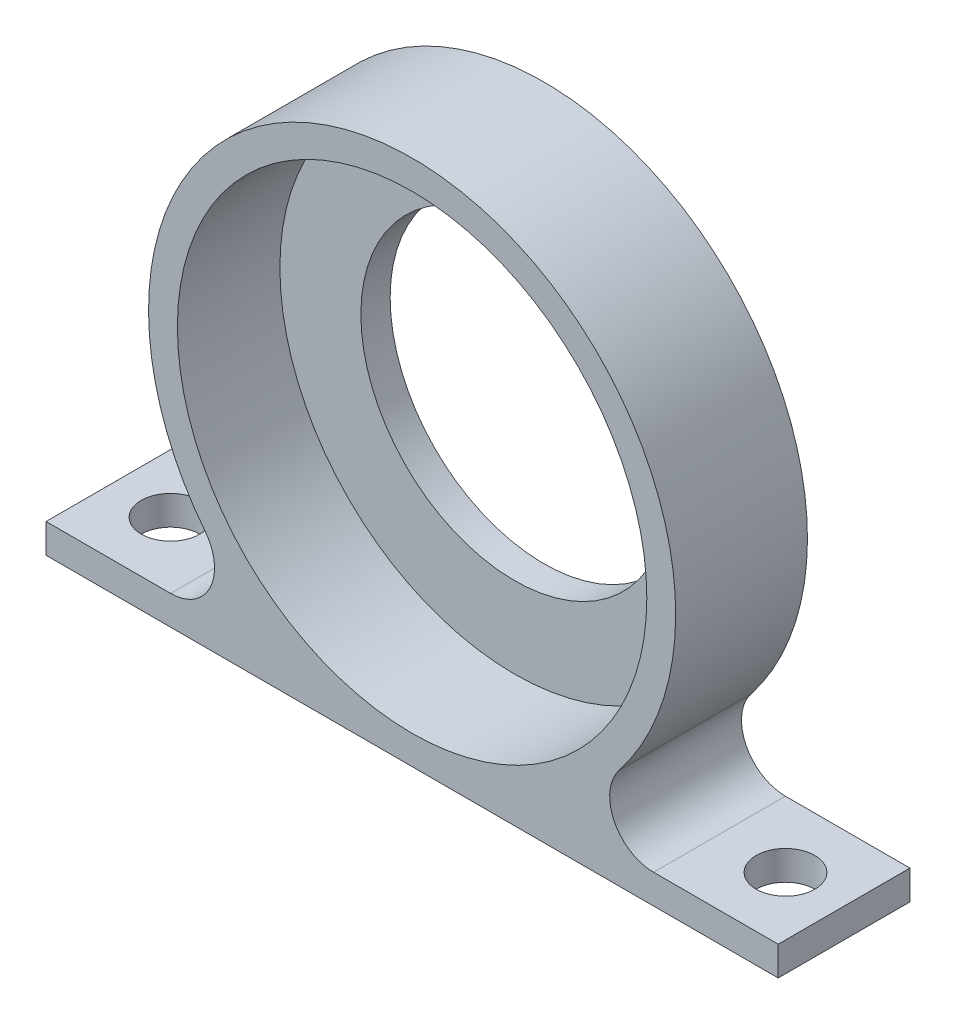
ISO-10303-21;
HEADER;
FILE_DESCRIPTION(('STEP AP214'),'2;1');
FILE_NAME('part.step','',(''),(''),'','','');
FILE_SCHEMA(('AUTOMOTIVE_DESIGN { 1 0 10303 214 1 1 1 1 }'));
ENDSEC;
DATA;
#1=APPLICATION_CONTEXT('core data for automotive mechanical design processes');
#2=APPLICATION_PROTOCOL_DEFINITION('international standard','automotive_design',2000,#1);
#3=PRODUCT_CONTEXT('',#1,'mechanical');
#4=PRODUCT('Part','Part','',(#3));
#5=PRODUCT_RELATED_PRODUCT_CATEGORY('part','',(#4));
#6=PRODUCT_DEFINITION_FORMATION('','',#4);
#7=PRODUCT_DEFINITION_CONTEXT('part definition',#1,'design');
#8=PRODUCT_DEFINITION('design','',#6,#7);
#9=PRODUCT_DEFINITION_SHAPE('','',#8);
#10=(LENGTH_UNIT() NAMED_UNIT(*) SI_UNIT(.MILLI.,.METRE.));
#11=(NAMED_UNIT(*) PLANE_ANGLE_UNIT() SI_UNIT($,.RADIAN.));
#12=(NAMED_UNIT(*) SI_UNIT($,.STERADIAN.) SOLID_ANGLE_UNIT());
#13=UNCERTAINTY_MEASURE_WITH_UNIT(LENGTH_MEASURE(1.E-05),#10,'distance_accuracy_value','');
#14=(GEOMETRIC_REPRESENTATION_CONTEXT(3) GLOBAL_UNCERTAINTY_ASSIGNED_CONTEXT((#13)) GLOBAL_UNIT_ASSIGNED_CONTEXT((#10,
#11,#12)) REPRESENTATION_CONTEXT('',''));
#15=CARTESIAN_POINT('',(0.,0.,0.));
#16=DIRECTION('',(0.,0.,1.));
#17=DIRECTION('',(1.,0.,0.));
#18=AXIS2_PLACEMENT_3D('',#15,#16,#17);
#19=CARTESIAN_POINT('',(0.,0.,9.));
#20=DIRECTION('',(0.,0.,-1.));
#21=DIRECTION('',(-1.,0.,0.));
#22=AXIS2_PLACEMENT_3D('',#19,#20,#21);
#23=CYLINDRICAL_SURFACE('',#22,16.03);
#24=CARTESIAN_POINT('',(0.,0.,9.));
#25=DIRECTION('',(0.,0.,1.));
#26=DIRECTION('',(1.,0.,0.));
#27=AXIS2_PLACEMENT_3D('',#24,#25,#26);
#28=CIRCLE('',#27,16.03);
#29=CARTESIAN_POINT('',(16.03,0.,9.));
#30=VERTEX_POINT('',#29);
#31=EDGE_CURVE('E138',#30,#30,#28,.T.);
#32=ORIENTED_EDGE('',*,*,#31,.T.);
#33=EDGE_LOOP('',(#32));
#34=FACE_BOUND('',#33,.T.);
#35=CARTESIAN_POINT('',(0.,0.,2.));
#36=DIRECTION('',(0.,0.,-1.));
#37=DIRECTION('',(-1.,0.,0.));
#38=AXIS2_PLACEMENT_3D('',#35,#36,#37);
#39=CIRCLE('',#38,16.03);
#40=CARTESIAN_POINT('',(-16.03,0.,2.));
#41=VERTEX_POINT('',#40);
#42=EDGE_CURVE('E145',#41,#41,#39,.T.);
#43=ORIENTED_EDGE('',*,*,#42,.T.);
#44=EDGE_LOOP('',(#43));
#45=FACE_BOUND('',#44,.T.);
#46=ADVANCED_FACE('F41',(#34,#45),#23,.F.);
#47=CARTESIAN_POINT('',(0.,0.,9.));
#48=DIRECTION('',(0.,0.,-1.));
#49=DIRECTION('',(-1.,0.,0.));
#50=AXIS2_PLACEMENT_3D('',#47,#48,#49);
#51=CYLINDRICAL_SURFACE('',#50,18.);
#52=CARTESIAN_POINT('',(0.,0.,9.));
#53=DIRECTION('',(0.,0.,1.));
#54=DIRECTION('',(1.,0.,0.));
#55=AXIS2_PLACEMENT_3D('',#52,#53,#54);
#56=CIRCLE('',#55,18.);
#57=CARTESIAN_POINT('',(14.1363621449748,-11.1428571428571,9.));
#58=VERTEX_POINT('',#57);
#59=CARTESIAN_POINT('',(-14.1363621449748,-11.1428571428571,9.));
#60=VERTEX_POINT('',#59);
#61=EDGE_CURVE('E126',#58,#60,#56,.T.);
#62=ORIENTED_EDGE('',*,*,#61,.F.);
#63=DIRECTION('',(0.,0.,-1.));
#64=VECTOR('',#63,1.);
#65=CARTESIAN_POINT('',(14.1363621449748,-11.1428571428571,9.));
#66=LINE('',#65,#64);
#67=CARTESIAN_POINT('',(14.1363621449748,-11.1428571428571,0.));
#68=VERTEX_POINT('',#67);
#69=EDGE_CURVE('E165',#58,#68,#66,.T.);
#70=ORIENTED_EDGE('',*,*,#69,.T.);
#71=CARTESIAN_POINT('',(0.,0.,0.));
#72=DIRECTION('',(0.,0.,1.));
#73=DIRECTION('',(1.,0.,0.));
#74=AXIS2_PLACEMENT_3D('',#71,#72,#73);
#75=CIRCLE('',#74,18.);
#76=CARTESIAN_POINT('',(-14.1363621449748,-11.1428571428571,0.));
#77=VERTEX_POINT('',#76);
#78=EDGE_CURVE('E142',#68,#77,#75,.T.);
#79=ORIENTED_EDGE('',*,*,#78,.T.);
#80=DIRECTION('',(0.,0.,-1.));
#81=VECTOR('',#80,1.);
#82=CARTESIAN_POINT('',(-14.1363621449748,-11.1428571428571,9.));
#83=LINE('',#82,#81);
#84=EDGE_CURVE('E114',#77,#60,#83,.F.);
#85=ORIENTED_EDGE('',*,*,#84,.T.);
#86=EDGE_LOOP('',(#62,#70,#79,#85));
#87=FACE_BOUND('',#86,.T.);
#88=ADVANCED_FACE('F181',(#87),#51,.T.);
#89=CARTESIAN_POINT('',(0.,-16.,9.));
#90=DIRECTION('',(0.,1.,0.));
#91=DIRECTION('',(0.,0.,1.));
#92=AXIS2_PLACEMENT_3D('',#89,#90,#91);
#93=PLANE('',#92);
#94=CARTESIAN_POINT('',(-21.,-16.,4.5));
#95=DIRECTION('',(0.,1.,0.));
#96=DIRECTION('',(0.,0.,1.));
#97=AXIS2_PLACEMENT_3D('',#94,#95,#96);
#98=CIRCLE('',#97,2.);
#99=CARTESIAN_POINT('',(-21.,-16.,6.5));
#100=VERTEX_POINT('',#99);
#101=EDGE_CURVE('E226',#100,#100,#98,.T.);
#102=ORIENTED_EDGE('',*,*,#101,.F.);
#103=EDGE_LOOP('',(#102));
#104=FACE_BOUND('',#103,.T.);
#105=DIRECTION('',(1.,0.,0.));
#106=VECTOR('',#105,1.);
#107=CARTESIAN_POINT('',(0.,-16.,9.));
#108=LINE('',#107,#106);
#109=CARTESIAN_POINT('',(-25.,-16.,9.));
#110=VERTEX_POINT('',#109);
#111=CARTESIAN_POINT('',(-16.4924225024706,-16.,9.));
#112=VERTEX_POINT('',#111);
#113=EDGE_CURVE('E108',#110,#112,#108,.T.);
#114=ORIENTED_EDGE('',*,*,#113,.T.);
#115=DIRECTION('',(0.,0.,-1.));
#116=VECTOR('',#115,1.);
#117=CARTESIAN_POINT('',(-16.4924225024706,-16.,9.));
#118=LINE('',#117,#116);
#119=CARTESIAN_POINT('',(-16.4924225024706,-16.,0.));
#120=VERTEX_POINT('',#119);
#121=EDGE_CURVE('E170',#112,#120,#118,.T.);
#122=ORIENTED_EDGE('',*,*,#121,.T.);
#123=DIRECTION('',(1.,0.,0.));
#124=VECTOR('',#123,1.);
#125=CARTESIAN_POINT('',(0.,-16.,0.));
#126=LINE('',#125,#124);
#127=CARTESIAN_POINT('',(-25.,-16.,0.));
#128=VERTEX_POINT('',#127);
#129=EDGE_CURVE('E110',#128,#120,#126,.T.);
#130=ORIENTED_EDGE('',*,*,#129,.F.);
#131=DIRECTION('',(0.,0.,-1.));
#132=VECTOR('',#131,1.);
#133=CARTESIAN_POINT('',(-25.,-16.,9.));
#134=LINE('',#133,#132);
#135=EDGE_CURVE('E105',#110,#128,#134,.T.);
#136=ORIENTED_EDGE('',*,*,#135,.F.);
#137=EDGE_LOOP('',(#114,#122,#130,#136));
#138=FACE_BOUND('',#137,.T.);
#139=ADVANCED_FACE('F107',(#104,#138),#93,.T.);
#140=CARTESIAN_POINT('',(-25.,0.,9.));
#141=DIRECTION('',(1.,0.,0.));
#142=DIRECTION('',(0.,0.,-1.));
#143=AXIS2_PLACEMENT_3D('',#140,#141,#142);
#144=PLANE('',#143);
#145=DIRECTION('',(0.,-1.,0.));
#146=VECTOR('',#145,1.);
#147=CARTESIAN_POINT('',(-25.,0.,0.));
#148=LINE('',#147,#146);
#149=CARTESIAN_POINT('',(-25.,-18.,0.));
#150=VERTEX_POINT('',#149);
#151=EDGE_CURVE('E147',#128,#150,#148,.T.);
#152=ORIENTED_EDGE('',*,*,#151,.T.);
#153=DIRECTION('',(0.,0.,-1.));
#154=VECTOR('',#153,1.);
#155=CARTESIAN_POINT('',(-25.,-18.,9.));
#156=LINE('',#155,#154);
#157=CARTESIAN_POINT('',(-25.,-18.,9.));
#158=VERTEX_POINT('',#157);
#159=EDGE_CURVE('E115',#158,#150,#156,.T.);
#160=ORIENTED_EDGE('',*,*,#159,.F.);
#161=DIRECTION('',(0.,-1.,0.));
#162=VECTOR('',#161,1.);
#163=CARTESIAN_POINT('',(-25.,0.,9.));
#164=LINE('',#163,#162);
#165=EDGE_CURVE('E118',#110,#158,#164,.T.);
#166=ORIENTED_EDGE('',*,*,#165,.F.);
#167=ORIENTED_EDGE('',*,*,#135,.T.);
#168=EDGE_LOOP('',(#152,#160,#166,#167));
#169=FACE_BOUND('',#168,.T.);
#170=ADVANCED_FACE('F119',(#169),#144,.F.);
#171=CARTESIAN_POINT('',(0.,-18.,9.));
#172=DIRECTION('',(0.,1.,0.));
#173=DIRECTION('',(0.,0.,1.));
#174=AXIS2_PLACEMENT_3D('',#171,#172,#173);
#175=PLANE('',#174);
#176=CARTESIAN_POINT('',(-21.,-18.,4.5));
#177=DIRECTION('',(0.,1.,0.));
#178=DIRECTION('',(0.,0.,1.));
#179=AXIS2_PLACEMENT_3D('',#176,#177,#178);
#180=CIRCLE('',#179,2.);
#181=CARTESIAN_POINT('',(-21.,-18.,6.5));
#182=VERTEX_POINT('',#181);
#183=EDGE_CURVE('E228',#182,#182,#180,.T.);
#184=ORIENTED_EDGE('',*,*,#183,.T.);
#185=EDGE_LOOP('',(#184));
#186=FACE_BOUND('',#185,.T.);
#187=CARTESIAN_POINT('',(21.,-18.,4.5));
#188=DIRECTION('',(0.,1.,0.));
#189=DIRECTION('',(0.,0.,1.));
#190=AXIS2_PLACEMENT_3D('',#187,#188,#189);
#191=CIRCLE('',#190,2.);
#192=CARTESIAN_POINT('',(21.,-18.,6.5));
#193=VERTEX_POINT('',#192);
#194=EDGE_CURVE('E235',#193,#193,#191,.T.);
#195=ORIENTED_EDGE('',*,*,#194,.T.);
#196=EDGE_LOOP('',(#195));
#197=FACE_BOUND('',#196,.T.);
#198=DIRECTION('',(1.,0.,0.));
#199=VECTOR('',#198,1.);
#200=CARTESIAN_POINT('',(0.,-18.,0.));
#201=LINE('',#200,#199);
#202=CARTESIAN_POINT('',(25.,-18.,0.));
#203=VERTEX_POINT('',#202);
#204=EDGE_CURVE('E149',#150,#203,#201,.T.);
#205=ORIENTED_EDGE('',*,*,#204,.T.);
#206=DIRECTION('',(0.,0.,-1.));
#207=VECTOR('',#206,1.);
#208=CARTESIAN_POINT('',(25.,-18.,9.));
#209=LINE('',#208,#207);
#210=CARTESIAN_POINT('',(25.,-18.,9.));
#211=VERTEX_POINT('',#210);
#212=EDGE_CURVE('E158',#211,#203,#209,.T.);
#213=ORIENTED_EDGE('',*,*,#212,.F.);
#214=DIRECTION('',(1.,0.,0.));
#215=VECTOR('',#214,1.);
#216=CARTESIAN_POINT('',(0.,-18.,9.));
#217=LINE('',#216,#215);
#218=EDGE_CURVE('E121',#158,#211,#217,.T.);
#219=ORIENTED_EDGE('',*,*,#218,.F.);
#220=ORIENTED_EDGE('',*,*,#159,.T.);
#221=EDGE_LOOP('',(#205,#213,#219,#220));
#222=FACE_BOUND('',#221,.T.);
#223=ADVANCED_FACE('F215',(#186,#197,#222),#175,.F.);
#224=CARTESIAN_POINT('',(25.,0.,9.));
#225=DIRECTION('',(1.,0.,0.));
#226=DIRECTION('',(0.,0.,-1.));
#227=AXIS2_PLACEMENT_3D('',#224,#225,#226);
#228=PLANE('',#227);
#229=DIRECTION('',(0.,-1.,0.));
#230=VECTOR('',#229,1.);
#231=CARTESIAN_POINT('',(25.,0.,0.));
#232=LINE('',#231,#230);
#233=CARTESIAN_POINT('',(25.,-16.,0.));
#234=VERTEX_POINT('',#233);
#235=EDGE_CURVE('E152',#234,#203,#232,.T.);
#236=ORIENTED_EDGE('',*,*,#235,.F.);
#237=DIRECTION('',(0.,0.,-1.));
#238=VECTOR('',#237,1.);
#239=CARTESIAN_POINT('',(25.,-16.,9.));
#240=LINE('',#239,#238);
#241=CARTESIAN_POINT('',(25.,-16.,9.));
#242=VERTEX_POINT('',#241);
#243=EDGE_CURVE('E141',#242,#234,#240,.T.);
#244=ORIENTED_EDGE('',*,*,#243,.F.);
#245=DIRECTION('',(0.,-1.,0.));
#246=VECTOR('',#245,1.);
#247=CARTESIAN_POINT('',(25.,0.,9.));
#248=LINE('',#247,#246);
#249=EDGE_CURVE('E133',#242,#211,#248,.T.);
#250=ORIENTED_EDGE('',*,*,#249,.T.);
#251=ORIENTED_EDGE('',*,*,#212,.T.);
#252=EDGE_LOOP('',(#236,#244,#250,#251));
#253=FACE_BOUND('',#252,.T.);
#254=ADVANCED_FACE('F211',(#253),#228,.T.);
#255=CARTESIAN_POINT('',(0.,-16.,9.));
#256=DIRECTION('',(0.,1.,0.));
#257=DIRECTION('',(0.,0.,1.));
#258=AXIS2_PLACEMENT_3D('',#255,#256,#257);
#259=PLANE('',#258);
#260=CARTESIAN_POINT('',(21.,-16.,4.5));
#261=DIRECTION('',(0.,1.,0.));
#262=DIRECTION('',(0.,0.,1.));
#263=AXIS2_PLACEMENT_3D('',#260,#261,#262);
#264=CIRCLE('',#263,2.);
#265=CARTESIAN_POINT('',(21.,-16.,6.5));
#266=VERTEX_POINT('',#265);
#267=EDGE_CURVE('E229',#266,#266,#264,.T.);
#268=ORIENTED_EDGE('',*,*,#267,.F.);
#269=EDGE_LOOP('',(#268));
#270=FACE_BOUND('',#269,.T.);
#271=DIRECTION('',(1.,0.,0.));
#272=VECTOR('',#271,1.);
#273=CARTESIAN_POINT('',(0.,-16.,0.));
#274=LINE('',#273,#272);
#275=CARTESIAN_POINT('',(16.4924225024706,-16.,0.));
#276=VERTEX_POINT('',#275);
#277=EDGE_CURVE('E128',#276,#234,#274,.T.);
#278=ORIENTED_EDGE('',*,*,#277,.F.);
#279=DIRECTION('',(0.,0.,-1.));
#280=VECTOR('',#279,1.);
#281=CARTESIAN_POINT('',(16.4924225024706,-16.,9.));
#282=LINE('',#281,#280);
#283=CARTESIAN_POINT('',(16.4924225024706,-16.,9.));
#284=VERTEX_POINT('',#283);
#285=EDGE_CURVE('E168',#276,#284,#282,.F.);
#286=ORIENTED_EDGE('',*,*,#285,.T.);
#287=DIRECTION('',(1.,0.,0.));
#288=VECTOR('',#287,1.);
#289=CARTESIAN_POINT('',(0.,-16.,9.));
#290=LINE('',#289,#288);
#291=EDGE_CURVE('E136',#284,#242,#290,.T.);
#292=ORIENTED_EDGE('',*,*,#291,.T.);
#293=ORIENTED_EDGE('',*,*,#243,.T.);
#294=EDGE_LOOP('',(#278,#286,#292,#293));
#295=FACE_BOUND('',#294,.T.);
#296=ADVANCED_FACE('F208',(#270,#295),#259,.T.);
#297=CARTESIAN_POINT('',(0.,0.,9.));
#298=DIRECTION('',(0.,0.,1.));
#299=DIRECTION('',(1.,0.,0.));
#300=AXIS2_PLACEMENT_3D('',#297,#298,#299);
#301=PLANE('',#300);
#302=ORIENTED_EDGE('',*,*,#291,.F.);
#303=CARTESIAN_POINT('',(16.4924225024706,-13.,9.));
#304=DIRECTION('',(0.,0.,1.));
#305=DIRECTION('',(1.,0.,0.));
#306=AXIS2_PLACEMENT_3D('',#303,#304,#305);
#307=CIRCLE('',#306,3.);
#308=EDGE_CURVE('E174',#284,#58,#307,.F.);
#309=ORIENTED_EDGE('',*,*,#308,.T.);
#310=ORIENTED_EDGE('',*,*,#61,.T.);
#311=CARTESIAN_POINT('',(-16.4924225024706,-13.,9.));
#312=DIRECTION('',(0.,0.,1.));
#313=DIRECTION('',(1.,0.,0.));
#314=AXIS2_PLACEMENT_3D('',#311,#312,#313);
#315=CIRCLE('',#314,3.);
#316=EDGE_CURVE('E11',#60,#112,#315,.F.);
#317=ORIENTED_EDGE('',*,*,#316,.T.);
#318=ORIENTED_EDGE('',*,*,#113,.F.);
#319=ORIENTED_EDGE('',*,*,#165,.T.);
#320=ORIENTED_EDGE('',*,*,#218,.T.);
#321=ORIENTED_EDGE('',*,*,#249,.F.);
#322=EDGE_LOOP('',(#302,#309,#310,#317,#318,#319,#320,#321));
#323=FACE_BOUND('',#322,.T.);
#324=ORIENTED_EDGE('',*,*,#31,.F.);
#325=EDGE_LOOP('',(#324));
#326=FACE_BOUND('',#325,.T.);
#327=ADVANCED_FACE('F124',(#323,#326),#301,.T.);
#328=CARTESIAN_POINT('',(0.,0.,0.));
#329=DIRECTION('',(0.,0.,1.));
#330=DIRECTION('',(1.,0.,0.));
#331=AXIS2_PLACEMENT_3D('',#328,#329,#330);
#332=PLANE('',#331);
#333=ORIENTED_EDGE('',*,*,#78,.F.);
#334=CARTESIAN_POINT('',(16.4924225024706,-13.,0.));
#335=DIRECTION('',(0.,0.,1.));
#336=DIRECTION('',(1.,0.,0.));
#337=AXIS2_PLACEMENT_3D('',#334,#335,#336);
#338=CIRCLE('',#337,3.);
#339=EDGE_CURVE('E172',#68,#276,#338,.T.);
#340=ORIENTED_EDGE('',*,*,#339,.T.);
#341=ORIENTED_EDGE('',*,*,#277,.T.);
#342=ORIENTED_EDGE('',*,*,#235,.T.);
#343=ORIENTED_EDGE('',*,*,#204,.F.);
#344=ORIENTED_EDGE('',*,*,#151,.F.);
#345=ORIENTED_EDGE('',*,*,#129,.T.);
#346=CARTESIAN_POINT('',(-16.4924225024706,-13.,0.));
#347=DIRECTION('',(0.,0.,1.));
#348=DIRECTION('',(1.,0.,0.));
#349=AXIS2_PLACEMENT_3D('',#346,#347,#348);
#350=CIRCLE('',#349,3.);
#351=EDGE_CURVE('E49',#120,#77,#350,.T.);
#352=ORIENTED_EDGE('',*,*,#351,.T.);
#353=EDGE_LOOP('',(#333,#340,#341,#342,#343,#344,#345,#352));
#354=FACE_BOUND('',#353,.T.);
#355=CARTESIAN_POINT('',(0.,0.,0.));
#356=DIRECTION('',(0.,0.,-1.));
#357=DIRECTION('',(-1.,0.,0.));
#358=AXIS2_PLACEMENT_3D('',#355,#356,#357);
#359=CIRCLE('',#358,10.5);
#360=CARTESIAN_POINT('',(-10.5,0.,0.));
#361=VERTEX_POINT('',#360);
#362=EDGE_CURVE('E232',#361,#361,#359,.T.);
#363=ORIENTED_EDGE('',*,*,#362,.F.);
#364=EDGE_LOOP('',(#363));
#365=FACE_BOUND('',#364,.T.);
#366=ADVANCED_FACE('F177',(#354,#365),#332,.F.);
#367=CARTESIAN_POINT('',(0.,0.,2.));
#368=DIRECTION('',(0.,0.,-1.));
#369=DIRECTION('',(-1.,0.,0.));
#370=AXIS2_PLACEMENT_3D('',#367,#368,#369);
#371=PLANE('',#370);
#372=CARTESIAN_POINT('',(0.,0.,2.));
#373=DIRECTION('',(0.,0.,-1.));
#374=DIRECTION('',(-1.,0.,0.));
#375=AXIS2_PLACEMENT_3D('',#372,#373,#374);
#376=CIRCLE('',#375,10.5);
#377=CARTESIAN_POINT('',(-10.5,0.,2.));
#378=VERTEX_POINT('',#377);
#379=EDGE_CURVE('E163',#378,#378,#376,.T.);
#380=ORIENTED_EDGE('',*,*,#379,.T.);
#381=EDGE_LOOP('',(#380));
#382=FACE_BOUND('',#381,.T.);
#383=ORIENTED_EDGE('',*,*,#42,.F.);
#384=EDGE_LOOP('',(#383));
#385=FACE_BOUND('',#384,.T.);
#386=ADVANCED_FACE('F245',(#382,#385),#371,.F.);
#387=CARTESIAN_POINT('',(0.,0.,2.));
#388=DIRECTION('',(0.,0.,-1.));
#389=DIRECTION('',(-1.,0.,0.));
#390=AXIS2_PLACEMENT_3D('',#387,#388,#389);
#391=CYLINDRICAL_SURFACE('',#390,10.5);
#392=ORIENTED_EDGE('',*,*,#379,.F.);
#393=EDGE_LOOP('',(#392));
#394=FACE_BOUND('',#393,.T.);
#395=ORIENTED_EDGE('',*,*,#362,.T.);
#396=EDGE_LOOP('',(#395));
#397=FACE_BOUND('',#396,.T.);
#398=ADVANCED_FACE('F194',(#394,#397),#391,.F.);
#399=CARTESIAN_POINT('',(16.4924225024706,-13.,9.));
#400=DIRECTION('',(0.,0.,-1.));
#401=DIRECTION('',(-1.,0.,0.));
#402=AXIS2_PLACEMENT_3D('',#399,#400,#401);
#403=CYLINDRICAL_SURFACE('',#402,3.);
#404=ORIENTED_EDGE('',*,*,#308,.F.);
#405=ORIENTED_EDGE('',*,*,#285,.F.);
#406=ORIENTED_EDGE('',*,*,#339,.F.);
#407=ORIENTED_EDGE('',*,*,#69,.F.);
#408=EDGE_LOOP('',(#404,#405,#406,#407));
#409=FACE_BOUND('',#408,.T.);
#410=ADVANCED_FACE('F185',(#409),#403,.F.);
#411=CARTESIAN_POINT('',(-16.4924225024706,-13.,9.));
#412=DIRECTION('',(0.,0.,-1.));
#413=DIRECTION('',(-1.,0.,0.));
#414=AXIS2_PLACEMENT_3D('',#411,#412,#413);
#415=CYLINDRICAL_SURFACE('',#414,3.);
#416=ORIENTED_EDGE('',*,*,#316,.F.);
#417=ORIENTED_EDGE('',*,*,#84,.F.);
#418=ORIENTED_EDGE('',*,*,#351,.F.);
#419=ORIENTED_EDGE('',*,*,#121,.F.);
#420=EDGE_LOOP('',(#416,#417,#418,#419));
#421=FACE_BOUND('',#420,.T.);
#422=ADVANCED_FACE('F43',(#421),#415,.F.);
#423=CARTESIAN_POINT('',(21.,-18.,4.5));
#424=DIRECTION('',(0.,1.,0.));
#425=DIRECTION('',(0.,0.,1.));
#426=AXIS2_PLACEMENT_3D('',#423,#424,#425);
#427=CYLINDRICAL_SURFACE('',#426,2.);
#428=ORIENTED_EDGE('',*,*,#194,.F.);
#429=EDGE_LOOP('',(#428));
#430=FACE_BOUND('',#429,.T.);
#431=ORIENTED_EDGE('',*,*,#267,.T.);
#432=EDGE_LOOP('',(#431));
#433=FACE_BOUND('',#432,.T.);
#434=ADVANCED_FACE('F184',(#430,#433),#427,.F.);
#435=CARTESIAN_POINT('',(-21.,-18.,4.5));
#436=DIRECTION('',(0.,1.,0.));
#437=DIRECTION('',(0.,0.,1.));
#438=AXIS2_PLACEMENT_3D('',#435,#436,#437);
#439=CYLINDRICAL_SURFACE('',#438,2.);
#440=ORIENTED_EDGE('',*,*,#183,.F.);
#441=EDGE_LOOP('',(#440));
#442=FACE_BOUND('',#441,.T.);
#443=ORIENTED_EDGE('',*,*,#101,.T.);
#444=EDGE_LOOP('',(#443));
#445=FACE_BOUND('',#444,.T.);
#446=ADVANCED_FACE('F191',(#442,#445),#439,.F.);
#447=CLOSED_SHELL('',(#46,#88,#139,#170,#223,#254,#296,#327,#366,#386,#398,#410,#422,#434,#446));
#448=MANIFOLD_SOLID_BREP('B2',#447);
#449=ADVANCED_BREP_SHAPE_REPRESENTATION('',(#18,#448),#14);
#450=SHAPE_DEFINITION_REPRESENTATION(#9,#449);
ENDSEC;
END-ISO-10303-21;
